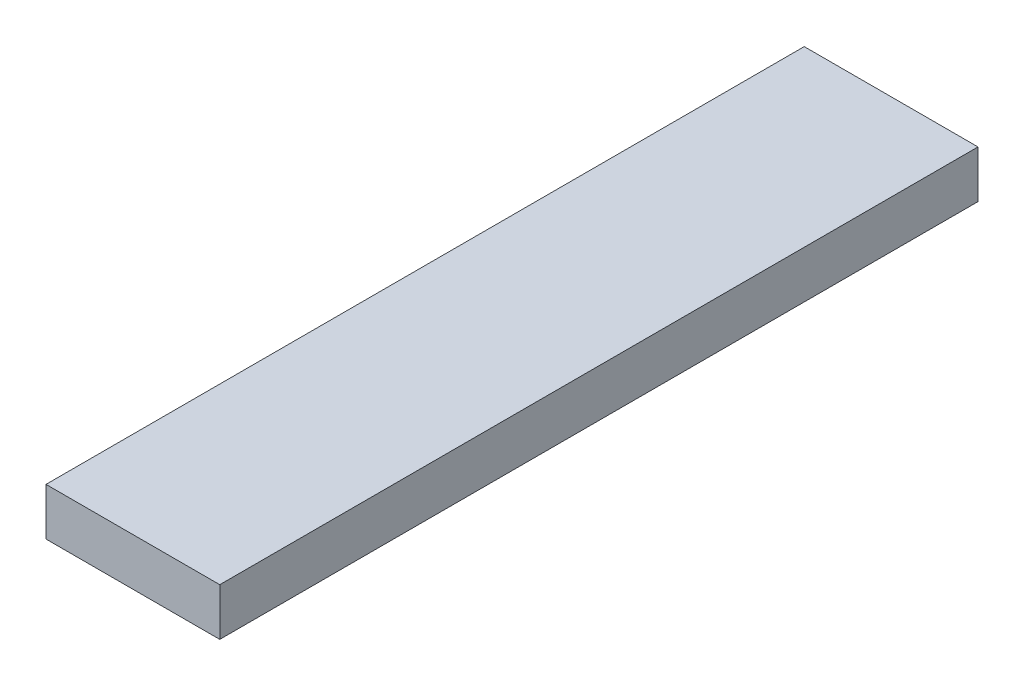
ISO-10303-21;
HEADER;
FILE_DESCRIPTION(('STEP AP214'),'2;1');
FILE_NAME('part.step','',(''),(''),'','','');
FILE_SCHEMA(('AUTOMOTIVE_DESIGN { 1 0 10303 214 1 1 1 1 }'));
ENDSEC;
DATA;
#1=APPLICATION_CONTEXT('core data for automotive mechanical design processes');
#2=APPLICATION_PROTOCOL_DEFINITION('international standard','automotive_design',2000,#1);
#3=PRODUCT_CONTEXT('',#1,'mechanical');
#4=PRODUCT('Part','Part','',(#3));
#5=PRODUCT_RELATED_PRODUCT_CATEGORY('part','',(#4));
#6=PRODUCT_DEFINITION_FORMATION('','',#4);
#7=PRODUCT_DEFINITION_CONTEXT('part definition',#1,'design');
#8=PRODUCT_DEFINITION('design','',#6,#7);
#9=PRODUCT_DEFINITION_SHAPE('','',#8);
#10=(LENGTH_UNIT() NAMED_UNIT(*) SI_UNIT(.MILLI.,.METRE.));
#11=(NAMED_UNIT(*) PLANE_ANGLE_UNIT() SI_UNIT($,.RADIAN.));
#12=(NAMED_UNIT(*) SI_UNIT($,.STERADIAN.) SOLID_ANGLE_UNIT());
#13=UNCERTAINTY_MEASURE_WITH_UNIT(LENGTH_MEASURE(1.E-05),#10,'distance_accuracy_value','');
#14=(GEOMETRIC_REPRESENTATION_CONTEXT(3) GLOBAL_UNCERTAINTY_ASSIGNED_CONTEXT((#13)) GLOBAL_UNIT_ASSIGNED_CONTEXT((#10,
#11,#12)) REPRESENTATION_CONTEXT('',''));
#15=CARTESIAN_POINT('',(0.,0.,0.));
#16=DIRECTION('',(0.,0.,1.));
#17=DIRECTION('',(1.,0.,0.));
#18=AXIS2_PLACEMENT_3D('',#15,#16,#17);
#19=CARTESIAN_POINT('',(69.85,-19.05,-304.8));
#20=DIRECTION('',(1.,0.,0.));
#21=DIRECTION('',(0.,0.,-1.));
#22=AXIS2_PLACEMENT_3D('',#19,#20,#21);
#23=PLANE('',#22);
#24=DIRECTION('',(0.,0.,1.));
#25=VECTOR('',#24,1.);
#26=CARTESIAN_POINT('',(69.85,19.05,-304.8));
#27=LINE('',#26,#25);
#28=CARTESIAN_POINT('',(69.85,19.05,-304.8));
#29=VERTEX_POINT('',#28);
#30=CARTESIAN_POINT('',(69.85,19.05,304.8));
#31=VERTEX_POINT('',#30);
#32=EDGE_CURVE('E36',#29,#31,#27,.T.);
#33=ORIENTED_EDGE('',*,*,#32,.T.);
#34=DIRECTION('',(0.,1.,0.));
#35=VECTOR('',#34,1.);
#36=CARTESIAN_POINT('',(69.85,-19.05,304.8));
#37=LINE('',#36,#35);
#38=CARTESIAN_POINT('',(69.85,-19.05,304.8));
#39=VERTEX_POINT('',#38);
#40=EDGE_CURVE('E73',#39,#31,#37,.T.);
#41=ORIENTED_EDGE('',*,*,#40,.F.);
#42=DIRECTION('',(0.,0.,1.));
#43=VECTOR('',#42,1.);
#44=CARTESIAN_POINT('',(69.85,-19.05,-304.8));
#45=LINE('',#44,#43);
#46=CARTESIAN_POINT('',(69.85,-19.05,-304.8));
#47=VERTEX_POINT('',#46);
#48=EDGE_CURVE('E11',#47,#39,#45,.T.);
#49=ORIENTED_EDGE('',*,*,#48,.F.);
#50=DIRECTION('',(0.,1.,0.));
#51=VECTOR('',#50,1.);
#52=CARTESIAN_POINT('',(69.85,-19.05,-304.8));
#53=LINE('',#52,#51);
#54=EDGE_CURVE('E74',#47,#29,#53,.T.);
#55=ORIENTED_EDGE('',*,*,#54,.T.);
#56=EDGE_LOOP('',(#33,#41,#49,#55));
#57=FACE_BOUND('',#56,.T.);
#58=ADVANCED_FACE('F33',(#57),#23,.T.);
#59=CARTESIAN_POINT('',(-69.85,-19.05,-304.8));
#60=DIRECTION('',(0.,-1.,0.));
#61=DIRECTION('',(0.,0.,-1.));
#62=AXIS2_PLACEMENT_3D('',#59,#60,#61);
#63=PLANE('',#62);
#64=ORIENTED_EDGE('',*,*,#48,.T.);
#65=DIRECTION('',(1.,0.,0.));
#66=VECTOR('',#65,1.);
#67=CARTESIAN_POINT('',(-69.85,-19.05,304.8));
#68=LINE('',#67,#66);
#69=CARTESIAN_POINT('',(-69.85,-19.05,304.8));
#70=VERTEX_POINT('',#69);
#71=EDGE_CURVE('E90',#70,#39,#68,.T.);
#72=ORIENTED_EDGE('',*,*,#71,.F.);
#73=DIRECTION('',(0.,0.,1.));
#74=VECTOR('',#73,1.);
#75=CARTESIAN_POINT('',(-69.85,-19.05,-304.8));
#76=LINE('',#75,#74);
#77=CARTESIAN_POINT('',(-69.85,-19.05,-304.8));
#78=VERTEX_POINT('',#77);
#79=EDGE_CURVE('E41',#78,#70,#76,.T.);
#80=ORIENTED_EDGE('',*,*,#79,.F.);
#81=DIRECTION('',(1.,0.,0.));
#82=VECTOR('',#81,1.);
#83=CARTESIAN_POINT('',(-69.85,-19.05,-304.8));
#84=LINE('',#83,#82);
#85=EDGE_CURVE('E79',#78,#47,#84,.T.);
#86=ORIENTED_EDGE('',*,*,#85,.T.);
#87=EDGE_LOOP('',(#64,#72,#80,#86));
#88=FACE_BOUND('',#87,.T.);
#89=ADVANCED_FACE('F105',(#88),#63,.T.);
#90=CARTESIAN_POINT('',(-69.85,-19.05,-304.8));
#91=DIRECTION('',(-1.,0.,0.));
#92=DIRECTION('',(0.,0.,1.));
#93=AXIS2_PLACEMENT_3D('',#90,#91,#92);
#94=PLANE('',#93);
#95=ORIENTED_EDGE('',*,*,#79,.T.);
#96=DIRECTION('',(0.,-1.,0.));
#97=VECTOR('',#96,1.);
#98=CARTESIAN_POINT('',(-69.85,-19.05,304.8));
#99=LINE('',#98,#97);
#100=CARTESIAN_POINT('',(-69.85,19.05,304.8));
#101=VERTEX_POINT('',#100);
#102=EDGE_CURVE('E86',#101,#70,#99,.T.);
#103=ORIENTED_EDGE('',*,*,#102,.F.);
#104=DIRECTION('',(0.,0.,1.));
#105=VECTOR('',#104,1.);
#106=CARTESIAN_POINT('',(-69.85,19.05,-304.8));
#107=LINE('',#106,#105);
#108=CARTESIAN_POINT('',(-69.85,19.05,-304.8));
#109=VERTEX_POINT('',#108);
#110=EDGE_CURVE('E78',#109,#101,#107,.T.);
#111=ORIENTED_EDGE('',*,*,#110,.F.);
#112=DIRECTION('',(0.,-1.,0.));
#113=VECTOR('',#112,1.);
#114=CARTESIAN_POINT('',(-69.85,-19.05,-304.8));
#115=LINE('',#114,#113);
#116=EDGE_CURVE('E98',#109,#78,#115,.T.);
#117=ORIENTED_EDGE('',*,*,#116,.T.);
#118=EDGE_LOOP('',(#95,#103,#111,#117));
#119=FACE_BOUND('',#118,.T.);
#120=ADVANCED_FACE('F102',(#119),#94,.T.);
#121=CARTESIAN_POINT('',(-69.85,19.05,-304.8));
#122=DIRECTION('',(0.,1.,0.));
#123=DIRECTION('',(0.,0.,1.));
#124=AXIS2_PLACEMENT_3D('',#121,#122,#123);
#125=PLANE('',#124);
#126=ORIENTED_EDGE('',*,*,#110,.T.);
#127=DIRECTION('',(-1.,0.,0.));
#128=VECTOR('',#127,1.);
#129=CARTESIAN_POINT('',(-69.85,19.05,304.8));
#130=LINE('',#129,#128);
#131=EDGE_CURVE('E81',#31,#101,#130,.T.);
#132=ORIENTED_EDGE('',*,*,#131,.F.);
#133=ORIENTED_EDGE('',*,*,#32,.F.);
#134=DIRECTION('',(-1.,0.,0.));
#135=VECTOR('',#134,1.);
#136=CARTESIAN_POINT('',(-69.85,19.05,-304.8));
#137=LINE('',#136,#135);
#138=EDGE_CURVE('E96',#29,#109,#137,.T.);
#139=ORIENTED_EDGE('',*,*,#138,.T.);
#140=EDGE_LOOP('',(#126,#132,#133,#139));
#141=FACE_BOUND('',#140,.T.);
#142=ADVANCED_FACE('F82',(#141),#125,.T.);
#143=CARTESIAN_POINT('',(0.,0.,-304.8));
#144=DIRECTION('',(0.,0.,-1.));
#145=DIRECTION('',(-1.,0.,0.));
#146=AXIS2_PLACEMENT_3D('',#143,#144,#145);
#147=PLANE('',#146);
#148=ORIENTED_EDGE('',*,*,#54,.F.);
#149=ORIENTED_EDGE('',*,*,#85,.F.);
#150=ORIENTED_EDGE('',*,*,#116,.F.);
#151=ORIENTED_EDGE('',*,*,#138,.F.);
#152=EDGE_LOOP('',(#148,#149,#150,#151));
#153=FACE_BOUND('',#152,.T.);
#154=ADVANCED_FACE('F107',(#153),#147,.T.);
#155=CARTESIAN_POINT('',(0.,0.,304.8));
#156=DIRECTION('',(0.,0.,-1.));
#157=DIRECTION('',(-1.,0.,0.));
#158=AXIS2_PLACEMENT_3D('',#155,#156,#157);
#159=PLANE('',#158);
#160=ORIENTED_EDGE('',*,*,#40,.T.);
#161=ORIENTED_EDGE('',*,*,#131,.T.);
#162=ORIENTED_EDGE('',*,*,#102,.T.);
#163=ORIENTED_EDGE('',*,*,#71,.T.);
#164=EDGE_LOOP('',(#160,#161,#162,#163));
#165=FACE_BOUND('',#164,.T.);
#166=ADVANCED_FACE('F89',(#165),#159,.F.);
#167=CLOSED_SHELL('',(#58,#89,#120,#142,#154,#166));
#168=MANIFOLD_SOLID_BREP('B2',#167);
#169=ADVANCED_BREP_SHAPE_REPRESENTATION('',(#18,#168),#14);
#170=SHAPE_DEFINITION_REPRESENTATION(#9,#169);
ENDSEC;
END-ISO-10303-21;
